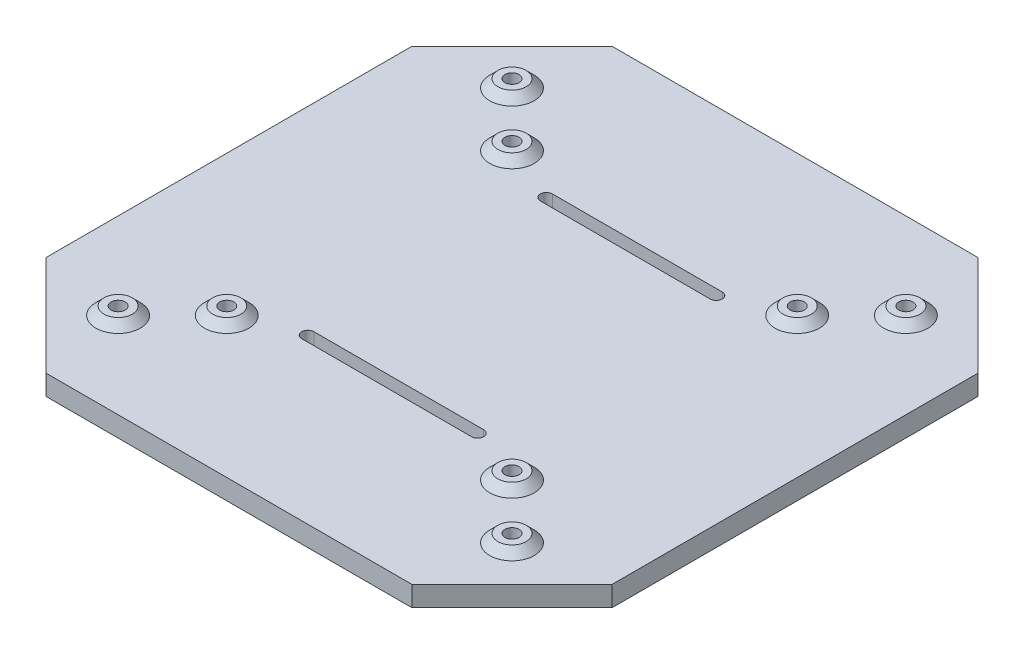
ISO-10303-21;
HEADER;
FILE_DESCRIPTION(('STEP AP214'),'2;1');
FILE_NAME('part.step','',(''),(''),'','','');
FILE_SCHEMA(('AUTOMOTIVE_DESIGN { 1 0 10303 214 1 1 1 1 }'));
ENDSEC;
DATA;
#1=APPLICATION_CONTEXT('core data for automotive mechanical design processes');
#2=APPLICATION_PROTOCOL_DEFINITION('international standard','automotive_design',2000,#1);
#3=PRODUCT_CONTEXT('',#1,'mechanical');
#4=PRODUCT('Part','Part','',(#3));
#5=PRODUCT_RELATED_PRODUCT_CATEGORY('part','',(#4));
#6=PRODUCT_DEFINITION_FORMATION('','',#4);
#7=PRODUCT_DEFINITION_CONTEXT('part definition',#1,'design');
#8=PRODUCT_DEFINITION('design','',#6,#7);
#9=PRODUCT_DEFINITION_SHAPE('','',#8);
#10=(LENGTH_UNIT() NAMED_UNIT(*) SI_UNIT(.MILLI.,.METRE.));
#11=(NAMED_UNIT(*) PLANE_ANGLE_UNIT() SI_UNIT($,.RADIAN.));
#12=(NAMED_UNIT(*) SI_UNIT($,.STERADIAN.) SOLID_ANGLE_UNIT());
#13=UNCERTAINTY_MEASURE_WITH_UNIT(LENGTH_MEASURE(1.E-05),#10,'distance_accuracy_value','');
#14=(GEOMETRIC_REPRESENTATION_CONTEXT(3) GLOBAL_UNCERTAINTY_ASSIGNED_CONTEXT((#13)) GLOBAL_UNIT_ASSIGNED_CONTEXT((#10,
#11,#12)) REPRESENTATION_CONTEXT('',''));
#15=CARTESIAN_POINT('',(0.,0.,0.));
#16=DIRECTION('',(0.,0.,1.));
#17=DIRECTION('',(1.,0.,0.));
#18=AXIS2_PLACEMENT_3D('',#15,#16,#17);
#19=CARTESIAN_POINT('',(0.,5.,0.));
#20=DIRECTION('',(0.,1.,0.));
#21=DIRECTION('',(0.,0.,1.));
#22=AXIS2_PLACEMENT_3D('',#19,#20,#21);
#23=PLANE('',#22);
#24=CARTESIAN_POINT('',(92.8000157602954,5.,88.1009215271201));
#25=DIRECTION('',(0.,1.,0.));
#26=DIRECTION('',(0.,0.,1.));
#27=AXIS2_PLACEMENT_3D('',#24,#25,#26);
#28=CIRCLE('',#27,5.50000000000002);
#29=CARTESIAN_POINT('',(92.8000157602954,5.,93.6009215271201));
#30=VERTEX_POINT('',#29);
#31=EDGE_CURVE('E371',#30,#30,#28,.T.);
#32=ORIENTED_EDGE('',*,*,#31,.F.);
#33=EDGE_LOOP('',(#32));
#34=FACE_BOUND('',#33,.T.);
#35=CARTESIAN_POINT('',(92.8000157602944,5.,-9.31614910521544));
#36=DIRECTION('',(0.,1.,0.));
#37=DIRECTION('',(0.,0.,1.));
#38=AXIS2_PLACEMENT_3D('',#35,#36,#37);
#39=CIRCLE('',#38,5.5);
#40=CARTESIAN_POINT('',(92.8000157602944,5.,-3.81614910521545));
#41=VERTEX_POINT('',#40);
#42=EDGE_CURVE('E495',#41,#41,#39,.T.);
#43=ORIENTED_EDGE('',*,*,#42,.F.);
#44=EDGE_LOOP('',(#43));
#45=FACE_BOUND('',#44,.T.);
#46=CARTESIAN_POINT('',(-4.61705487204114,5.,-9.31614910521412));
#47=DIRECTION('',(0.,1.,0.));
#48=DIRECTION('',(0.,0.,1.));
#49=AXIS2_PLACEMENT_3D('',#46,#47,#48);
#50=CIRCLE('',#49,5.50000000000001);
#51=CARTESIAN_POINT('',(-4.61705487204114,5.,-3.81614910521412));
#52=VERTEX_POINT('',#51);
#53=EDGE_CURVE('E499',#52,#52,#50,.T.);
#54=ORIENTED_EDGE('',*,*,#53,.F.);
#55=EDGE_LOOP('',(#54));
#56=FACE_BOUND('',#55,.T.);
#57=CARTESIAN_POINT('',(-4.61705487203946,5.,88.1009215271214));
#58=DIRECTION('',(0.,1.,0.));
#59=DIRECTION('',(0.,0.,1.));
#60=AXIS2_PLACEMENT_3D('',#57,#58,#59);
#61=CIRCLE('',#60,5.5);
#62=CARTESIAN_POINT('',(-4.61705487203946,5.,93.6009215271214));
#63=VERTEX_POINT('',#62);
#64=EDGE_CURVE('E172',#63,#63,#61,.T.);
#65=ORIENTED_EDGE('',*,*,#64,.F.);
#66=EDGE_LOOP('',(#65));
#67=FACE_BOUND('',#66,.T.);
#68=CARTESIAN_POINT('',(23.0914804441269,5.,9.89238621095243));
#69=DIRECTION('',(0.,1.,0.));
#70=DIRECTION('',(0.,0.,1.));
#71=AXIS2_PLACEMENT_3D('',#68,#69,#70);
#72=CIRCLE('',#71,1.5);
#73=CARTESIAN_POINT('',(23.0914804441269,5.,8.39238621095243));
#74=VERTEX_POINT('',#73);
#75=CARTESIAN_POINT('',(23.0914804441269,5.,11.3923862109524));
#76=VERTEX_POINT('',#75);
#77=EDGE_CURVE('E50',#74,#76,#72,.T.);
#78=ORIENTED_EDGE('',*,*,#77,.F.);
#79=DIRECTION('',(-1.,0.,0.));
#80=VECTOR('',#79,1.);
#81=CARTESIAN_POINT('',(65.0914804441269,5.,8.39238621095241));
#82=LINE('',#81,#80);
#83=CARTESIAN_POINT('',(65.0914804441269,5.,8.39238621095241));
#84=VERTEX_POINT('',#83);
#85=EDGE_CURVE('E166',#84,#74,#82,.T.);
#86=ORIENTED_EDGE('',*,*,#85,.F.);
#87=CARTESIAN_POINT('',(65.0914804441269,5.,9.89238621095243));
#88=DIRECTION('',(0.,1.,0.));
#89=DIRECTION('',(0.,0.,-1.));
#90=AXIS2_PLACEMENT_3D('',#87,#88,#89);
#91=CIRCLE('',#90,1.50000000000001);
#92=CARTESIAN_POINT('',(65.0914804441269,5.,11.3923862109524));
#93=VERTEX_POINT('',#92);
#94=EDGE_CURVE('E169',#93,#84,#91,.T.);
#95=ORIENTED_EDGE('',*,*,#94,.F.);
#96=DIRECTION('',(1.,0.,0.));
#97=VECTOR('',#96,1.);
#98=CARTESIAN_POINT('',(23.0914804441269,5.,11.3923862109524));
#99=LINE('',#98,#97);
#100=EDGE_CURVE('E178',#76,#93,#99,.T.);
#101=ORIENTED_EDGE('',*,*,#100,.F.);
#102=EDGE_LOOP('',(#78,#86,#95,#101));
#103=FACE_BOUND('',#102,.T.);
#104=CARTESIAN_POINT('',(65.0914804441269,5.,68.8923862109524));
#105=DIRECTION('',(0.,1.,0.));
#106=DIRECTION('',(0.,0.,-1.));
#107=AXIS2_PLACEMENT_3D('',#104,#105,#106);
#108=CIRCLE('',#107,1.50377722057659);
#109=CARTESIAN_POINT('',(64.9849631726398,5.,70.3923862109524));
#110=VERTEX_POINT('',#109);
#111=CARTESIAN_POINT('',(64.9849631726398,5.,67.3923862109524));
#112=VERTEX_POINT('',#111);
#113=EDGE_CURVE('E184',#110,#112,#108,.T.);
#114=ORIENTED_EDGE('',*,*,#113,.F.);
#115=DIRECTION('',(1.,0.,0.));
#116=VECTOR('',#115,1.);
#117=CARTESIAN_POINT('',(23.0914804441269,5.,70.3923862109524));
#118=LINE('',#117,#116);
#119=CARTESIAN_POINT('',(23.0914804441269,5.,70.3923862109524));
#120=VERTEX_POINT('',#119);
#121=EDGE_CURVE('E192',#120,#110,#118,.T.);
#122=ORIENTED_EDGE('',*,*,#121,.F.);
#123=CARTESIAN_POINT('',(23.0914804441269,5.,68.8923862109524));
#124=DIRECTION('',(0.,1.,0.));
#125=DIRECTION('',(0.,0.,1.));
#126=AXIS2_PLACEMENT_3D('',#123,#124,#125);
#127=CIRCLE('',#126,1.49999999999999);
#128=CARTESIAN_POINT('',(23.0914804441269,5.,67.3923862109524));
#129=VERTEX_POINT('',#128);
#130=EDGE_CURVE('E206',#129,#120,#127,.T.);
#131=ORIENTED_EDGE('',*,*,#130,.F.);
#132=DIRECTION('',(-1.,0.,0.));
#133=VECTOR('',#132,1.);
#134=CARTESIAN_POINT('',(64.9849631726398,5.,67.3923862109524));
#135=LINE('',#134,#133);
#136=EDGE_CURVE('E203',#112,#129,#135,.T.);
#137=ORIENTED_EDGE('',*,*,#136,.F.);
#138=EDGE_LOOP('',(#114,#122,#131,#137));
#139=FACE_BOUND('',#138,.T.);
#140=DIRECTION('',(-0.707106781186539,0.,-0.707106781186556));
#141=VECTOR('',#140,1.);
#142=CARTESIAN_POINT('',(-25.9085195558723,5.,84.6436488694239));
#143=LINE('',#142,#141);
#144=CARTESIAN_POINT('',(-1.15978221434344,5.,109.392386210953));
#145=VERTEX_POINT('',#144);
#146=CARTESIAN_POINT('',(-25.9085195558723,5.,84.6436488694239));
#147=VERTEX_POINT('',#146);
#148=EDGE_CURVE('E213',#145,#147,#143,.T.);
#149=ORIENTED_EDGE('',*,*,#148,.F.);
#150=DIRECTION('',(1.,0.,0.));
#151=VECTOR('',#150,1.);
#152=CARTESIAN_POINT('',(-25.9085195558734,5.,109.392386210953));
#153=LINE('',#152,#151);
#154=CARTESIAN_POINT('',(89.3427431025989,5.,109.392386210953));
#155=VERTEX_POINT('',#154);
#156=EDGE_CURVE('E266',#145,#155,#153,.T.);
#157=ORIENTED_EDGE('',*,*,#156,.T.);
#158=DIRECTION('',(-0.707106781186554,0.,0.707106781186541));
#159=VECTOR('',#158,1.);
#160=CARTESIAN_POINT('',(89.3427431025989,5.,109.392386210953));
#161=LINE('',#160,#159);
#162=CARTESIAN_POINT('',(114.091480444128,5.,84.6436488694236));
#163=VERTEX_POINT('',#162);
#164=EDGE_CURVE('E228',#163,#155,#161,.T.);
#165=ORIENTED_EDGE('',*,*,#164,.F.);
#166=DIRECTION('',(0.,0.,-1.));
#167=VECTOR('',#166,1.);
#168=CARTESIAN_POINT('',(114.091480444127,5.,-30.6076137890466));
#169=LINE('',#168,#167);
#170=CARTESIAN_POINT('',(114.091480444127,5.,-5.85887644751872));
#171=VERTEX_POINT('',#170);
#172=EDGE_CURVE('E269',#163,#171,#169,.T.);
#173=ORIENTED_EDGE('',*,*,#172,.T.);
#174=DIRECTION('',(0.707106781186543,0.,0.707106781186551));
#175=VECTOR('',#174,1.);
#176=CARTESIAN_POINT('',(114.091480444127,5.,-5.85887644751872));
#177=LINE('',#176,#175);
#178=CARTESIAN_POINT('',(89.3427431025981,5.,-30.607613789048));
#179=VERTEX_POINT('',#178);
#180=EDGE_CURVE('E239',#179,#171,#177,.T.);
#181=ORIENTED_EDGE('',*,*,#180,.F.);
#182=DIRECTION('',(-1.,0.,0.));
#183=VECTOR('',#182,1.);
#184=CARTESIAN_POINT('',(-25.9085195558735,5.,-30.6076137890466));
#185=LINE('',#184,#183);
#186=CARTESIAN_POINT('',(-1.15978221434423,5.,-30.6076137890466));
#187=VERTEX_POINT('',#186);
#188=EDGE_CURVE('E271',#179,#187,#185,.T.);
#189=ORIENTED_EDGE('',*,*,#188,.T.);
#190=DIRECTION('',(0.707106781186549,0.,-0.707106781186546));
#191=VECTOR('',#190,1.);
#192=CARTESIAN_POINT('',(-1.15978221434423,5.,-30.6076137890466));
#193=LINE('',#192,#191);
#194=CARTESIAN_POINT('',(-25.9085195558734,5.,-5.85887644751746));
#195=VERTEX_POINT('',#194);
#196=EDGE_CURVE('E250',#195,#187,#193,.T.);
#197=ORIENTED_EDGE('',*,*,#196,.F.);
#198=DIRECTION('',(0.,0.,1.));
#199=VECTOR('',#198,1.);
#200=CARTESIAN_POINT('',(-25.9085195558735,5.,-30.6076137890466));
#201=LINE('',#200,#199);
#202=EDGE_CURVE('E263',#195,#147,#201,.T.);
#203=ORIENTED_EDGE('',*,*,#202,.T.);
#204=EDGE_LOOP('',(#149,#157,#165,#173,#181,#189,#197,#203));
#205=FACE_BOUND('',#204,.T.);
#206=CARTESIAN_POINT('',(8.8179739705049,5.,74.665892684577));
#207=DIRECTION('',(0.,1.,0.));
#208=DIRECTION('',(0.,0.,1.));
#209=AXIS2_PLACEMENT_3D('',#206,#207,#208);
#210=CIRCLE('',#209,5.5);
#211=CARTESIAN_POINT('',(8.8179739705049,5.,80.165892684577));
#212=VERTEX_POINT('',#211);
#213=EDGE_CURVE('E474',#212,#212,#210,.T.);
#214=ORIENTED_EDGE('',*,*,#213,.F.);
#215=EDGE_LOOP('',(#214));
#216=FACE_BOUND('',#215,.T.);
#217=CARTESIAN_POINT('',(8.81797397050321,5.,4.11887973733029));
#218=DIRECTION('',(0.,1.,0.));
#219=DIRECTION('',(0.,0.,1.));
#220=AXIS2_PLACEMENT_3D('',#217,#218,#219);
#221=CIRCLE('',#220,5.5);
#222=CARTESIAN_POINT('',(8.81797397050321,5.,9.61887973733029));
#223=VERTEX_POINT('',#222);
#224=EDGE_CURVE('E478',#223,#223,#221,.T.);
#225=ORIENTED_EDGE('',*,*,#224,.F.);
#226=EDGE_LOOP('',(#225));
#227=FACE_BOUND('',#226,.T.);
#228=CARTESIAN_POINT('',(79.36498691775,5.,4.11887973732887));
#229=DIRECTION('',(0.,1.,0.));
#230=DIRECTION('',(0.,0.,1.));
#231=AXIS2_PLACEMENT_3D('',#228,#229,#230);
#232=CIRCLE('',#231,5.49999999999999);
#233=CARTESIAN_POINT('',(79.36498691775,5.,9.61887973732886));
#234=VERTEX_POINT('',#233);
#235=EDGE_CURVE('E482',#234,#234,#232,.T.);
#236=ORIENTED_EDGE('',*,*,#235,.F.);
#237=EDGE_LOOP('',(#236));
#238=FACE_BOUND('',#237,.T.);
#239=CARTESIAN_POINT('',(79.3649869177512,5.,74.6658926845756));
#240=DIRECTION('',(0.,1.,0.));
#241=DIRECTION('',(0.,0.,1.));
#242=AXIS2_PLACEMENT_3D('',#239,#240,#241);
#243=CIRCLE('',#242,5.5);
#244=CARTESIAN_POINT('',(79.3649869177512,5.,80.1658926845756));
#245=VERTEX_POINT('',#244);
#246=EDGE_CURVE('E485',#245,#245,#243,.T.);
#247=ORIENTED_EDGE('',*,*,#246,.F.);
#248=EDGE_LOOP('',(#247));
#249=FACE_BOUND('',#248,.T.);
#250=ADVANCED_FACE('F35',(#34,#45,#56,#67,#103,#139,#205,#216,#227,#238,#249),#23,.T.);
#251=CARTESIAN_POINT('',(-25.9085195558735,5.,-30.6076137890466));
#252=DIRECTION('',(1.,0.,0.));
#253=DIRECTION('',(0.,0.,-1.));
#254=AXIS2_PLACEMENT_3D('',#251,#252,#253);
#255=PLANE('',#254);
#256=DIRECTION('',(0.,0.,1.));
#257=VECTOR('',#256,1.);
#258=CARTESIAN_POINT('',(-25.9085195558735,0.,-30.6076137890466));
#259=LINE('',#258,#257);
#260=CARTESIAN_POINT('',(-25.9085195558734,0.,-5.85887644751746));
#261=VERTEX_POINT('',#260);
#262=CARTESIAN_POINT('',(-25.9085195558734,0.,84.6436488694227));
#263=VERTEX_POINT('',#262);
#264=EDGE_CURVE('E261',#261,#263,#259,.T.);
#265=ORIENTED_EDGE('',*,*,#264,.T.);
#266=DIRECTION('',(0.,1.,0.));
#267=VECTOR('',#266,1.);
#268=CARTESIAN_POINT('',(-25.9085195558723,0.,84.6436488694239));
#269=LINE('',#268,#267);
#270=EDGE_CURVE('E225',#263,#147,#269,.T.);
#271=ORIENTED_EDGE('',*,*,#270,.T.);
#272=ORIENTED_EDGE('',*,*,#202,.F.);
#273=DIRECTION('',(0.,1.,0.));
#274=VECTOR('',#273,1.);
#275=CARTESIAN_POINT('',(-25.9085195558734,0.,-5.85887644751746));
#276=LINE('',#275,#274);
#277=EDGE_CURVE('E255',#261,#195,#276,.T.);
#278=ORIENTED_EDGE('',*,*,#277,.F.);
#279=EDGE_LOOP('',(#265,#271,#272,#278));
#280=FACE_BOUND('',#279,.T.);
#281=ADVANCED_FACE('F317',(#280),#255,.F.);
#282=CARTESIAN_POINT('',(-25.9085195558734,5.,109.392386210953));
#283=DIRECTION('',(0.,0.,-1.));
#284=DIRECTION('',(-1.,0.,0.));
#285=AXIS2_PLACEMENT_3D('',#282,#283,#284);
#286=PLANE('',#285);
#287=ORIENTED_EDGE('',*,*,#156,.F.);
#288=DIRECTION('',(0.,1.,0.));
#289=VECTOR('',#288,1.);
#290=CARTESIAN_POINT('',(-1.15978221434344,0.,109.392386210953));
#291=LINE('',#290,#289);
#292=CARTESIAN_POINT('',(-1.15978221434344,0.,109.392386210953));
#293=VERTEX_POINT('',#292);
#294=EDGE_CURVE('E223',#293,#145,#291,.T.);
#295=ORIENTED_EDGE('',*,*,#294,.F.);
#296=DIRECTION('',(1.,0.,0.));
#297=VECTOR('',#296,1.);
#298=CARTESIAN_POINT('',(-25.9085195558734,0.,109.392386210953));
#299=LINE('',#298,#297);
#300=CARTESIAN_POINT('',(89.3427431025979,0.,109.392386210953));
#301=VERTEX_POINT('',#300);
#302=EDGE_CURVE('E276',#293,#301,#299,.T.);
#303=ORIENTED_EDGE('',*,*,#302,.T.);
#304=DIRECTION('',(0.,1.,0.));
#305=VECTOR('',#304,1.);
#306=CARTESIAN_POINT('',(89.3427431025989,0.,109.392386210953));
#307=LINE('',#306,#305);
#308=EDGE_CURVE('E236',#301,#155,#307,.T.);
#309=ORIENTED_EDGE('',*,*,#308,.T.);
#310=EDGE_LOOP('',(#287,#295,#303,#309));
#311=FACE_BOUND('',#310,.T.);
#312=ADVANCED_FACE('F325',(#311),#286,.F.);
#313=CARTESIAN_POINT('',(114.091480444127,5.,-30.6076137890466));
#314=DIRECTION('',(-1.,0.,0.));
#315=DIRECTION('',(0.,0.,1.));
#316=AXIS2_PLACEMENT_3D('',#313,#314,#315);
#317=PLANE('',#316);
#318=ORIENTED_EDGE('',*,*,#172,.F.);
#319=DIRECTION('',(0.,1.,0.));
#320=VECTOR('',#319,1.);
#321=CARTESIAN_POINT('',(114.091480444128,0.,84.6436488694236));
#322=LINE('',#321,#320);
#323=CARTESIAN_POINT('',(114.091480444128,0.,84.6436488694236));
#324=VERTEX_POINT('',#323);
#325=EDGE_CURVE('E233',#324,#163,#322,.T.);
#326=ORIENTED_EDGE('',*,*,#325,.F.);
#327=DIRECTION('',(0.,0.,-1.));
#328=VECTOR('',#327,1.);
#329=CARTESIAN_POINT('',(114.091480444127,0.,-30.6076137890466));
#330=LINE('',#329,#328);
#331=CARTESIAN_POINT('',(114.091480444127,0.,-5.85887644751923));
#332=VERTEX_POINT('',#331);
#333=EDGE_CURVE('E278',#324,#332,#330,.T.);
#334=ORIENTED_EDGE('',*,*,#333,.T.);
#335=DIRECTION('',(0.,1.,0.));
#336=VECTOR('',#335,1.);
#337=CARTESIAN_POINT('',(114.091480444127,0.,-5.85887644751872));
#338=LINE('',#337,#336);
#339=EDGE_CURVE('E247',#332,#171,#338,.T.);
#340=ORIENTED_EDGE('',*,*,#339,.T.);
#341=EDGE_LOOP('',(#318,#326,#334,#340));
#342=FACE_BOUND('',#341,.T.);
#343=ADVANCED_FACE('F340',(#342),#317,.F.);
#344=CARTESIAN_POINT('',(-25.9085195558735,5.,-30.6076137890466));
#345=DIRECTION('',(0.,0.,1.));
#346=DIRECTION('',(1.,0.,0.));
#347=AXIS2_PLACEMENT_3D('',#344,#345,#346);
#348=PLANE('',#347);
#349=ORIENTED_EDGE('',*,*,#188,.F.);
#350=DIRECTION('',(0.,1.,0.));
#351=VECTOR('',#350,1.);
#352=CARTESIAN_POINT('',(89.3427431025981,0.,-30.607613789048));
#353=LINE('',#352,#351);
#354=CARTESIAN_POINT('',(89.3427431025981,0.,-30.607613789048));
#355=VERTEX_POINT('',#354);
#356=EDGE_CURVE('E244',#355,#179,#353,.T.);
#357=ORIENTED_EDGE('',*,*,#356,.F.);
#358=DIRECTION('',(-1.,0.,0.));
#359=VECTOR('',#358,1.);
#360=CARTESIAN_POINT('',(-25.9085195558735,0.,-30.6076137890466));
#361=LINE('',#360,#359);
#362=CARTESIAN_POINT('',(-1.15978221434423,0.,-30.6076137890466));
#363=VERTEX_POINT('',#362);
#364=EDGE_CURVE('E267',#355,#363,#361,.T.);
#365=ORIENTED_EDGE('',*,*,#364,.T.);
#366=DIRECTION('',(0.,1.,0.));
#367=VECTOR('',#366,1.);
#368=CARTESIAN_POINT('',(-1.15978221434423,0.,-30.6076137890466));
#369=LINE('',#368,#367);
#370=EDGE_CURVE('E258',#363,#187,#369,.T.);
#371=ORIENTED_EDGE('',*,*,#370,.T.);
#372=EDGE_LOOP('',(#349,#357,#365,#371));
#373=FACE_BOUND('',#372,.T.);
#374=ADVANCED_FACE('F336',(#373),#348,.F.);
#375=CARTESIAN_POINT('',(0.,0.,0.));
#376=DIRECTION('',(0.,1.,0.));
#377=DIRECTION('',(0.,0.,1.));
#378=AXIS2_PLACEMENT_3D('',#375,#376,#377);
#379=PLANE('',#378);
#380=CARTESIAN_POINT('',(79.3649869177514,0.,74.6658926845787));
#381=DIRECTION('',(0.,1.,0.));
#382=DIRECTION('',(0.,0.,1.));
#383=AXIS2_PLACEMENT_3D('',#380,#381,#382);
#384=CIRCLE('',#383,1.75000000000001);
#385=CARTESIAN_POINT('',(79.3649869177514,0.,76.4158926845787));
#386=VERTEX_POINT('',#385);
#387=EDGE_CURVE('E570',#386,#386,#384,.T.);
#388=ORIENTED_EDGE('',*,*,#387,.T.);
#389=EDGE_LOOP('',(#388));
#390=FACE_BOUND('',#389,.T.);
#391=CARTESIAN_POINT('',(92.8000157602962,0.,88.1009215271227));
#392=DIRECTION('',(0.,1.,0.));
#393=DIRECTION('',(0.,0.,1.));
#394=AXIS2_PLACEMENT_3D('',#391,#392,#393);
#395=CIRCLE('',#394,1.74999999999998);
#396=CARTESIAN_POINT('',(92.8000157602962,0.,89.8509215271226));
#397=VERTEX_POINT('',#396);
#398=EDGE_CURVE('E564',#397,#397,#395,.T.);
#399=ORIENTED_EDGE('',*,*,#398,.T.);
#400=EDGE_LOOP('',(#399));
#401=FACE_BOUND('',#400,.T.);
#402=CARTESIAN_POINT('',(79.3649869177533,0.,4.11887973733166));
#403=DIRECTION('',(0.,1.,0.));
#404=DIRECTION('',(0.,0.,1.));
#405=AXIS2_PLACEMENT_3D('',#402,#403,#404);
#406=CIRCLE('',#405,1.74999999999999);
#407=CARTESIAN_POINT('',(79.3649869177533,0.,5.86887973733165));
#408=VERTEX_POINT('',#407);
#409=EDGE_CURVE('E558',#408,#408,#406,.T.);
#410=ORIENTED_EDGE('',*,*,#409,.T.);
#411=EDGE_LOOP('',(#410));
#412=FACE_BOUND('',#411,.T.);
#413=CARTESIAN_POINT('',(92.8000157602974,0.,-9.316149105213));
#414=DIRECTION('',(0.,1.,0.));
#415=DIRECTION('',(0.,0.,1.));
#416=AXIS2_PLACEMENT_3D('',#413,#414,#415);
#417=CIRCLE('',#416,1.75);
#418=CARTESIAN_POINT('',(92.8000157602974,0.,-7.566149105213));
#419=VERTEX_POINT('',#418);
#420=EDGE_CURVE('E552',#419,#419,#417,.T.);
#421=ORIENTED_EDGE('',*,*,#420,.T.);
#422=EDGE_LOOP('',(#421));
#423=FACE_BOUND('',#422,.T.);
#424=CARTESIAN_POINT('',(8.81797397050627,0.,4.11887973733004));
#425=DIRECTION('',(0.,1.,0.));
#426=DIRECTION('',(0.,0.,1.));
#427=AXIS2_PLACEMENT_3D('',#424,#425,#426);
#428=CIRCLE('',#427,1.75);
#429=CARTESIAN_POINT('',(8.81797397050627,0.,5.86887973733004));
#430=VERTEX_POINT('',#429);
#431=EDGE_CURVE('E546',#430,#430,#428,.T.);
#432=ORIENTED_EDGE('',*,*,#431,.T.);
#433=EDGE_LOOP('',(#432));
#434=FACE_BOUND('',#433,.T.);
#435=CARTESIAN_POINT('',(-4.61705487203827,0.,-9.3161491052142));
#436=DIRECTION('',(0.,1.,0.));
#437=DIRECTION('',(0.,0.,1.));
#438=AXIS2_PLACEMENT_3D('',#435,#436,#437);
#439=CIRCLE('',#438,1.75);
#440=CARTESIAN_POINT('',(-4.61705487203827,0.,-7.5661491052142));
#441=VERTEX_POINT('',#440);
#442=EDGE_CURVE('E540',#441,#441,#439,.T.);
#443=ORIENTED_EDGE('',*,*,#442,.T.);
#444=EDGE_LOOP('',(#443));
#445=FACE_BOUND('',#444,.T.);
#446=CARTESIAN_POINT('',(8.8179739705049,0.,74.665892684577));
#447=DIRECTION('',(0.,1.,0.));
#448=DIRECTION('',(0.,0.,1.));
#449=AXIS2_PLACEMENT_3D('',#446,#447,#448);
#450=CIRCLE('',#449,1.75);
#451=CARTESIAN_POINT('',(8.8179739705049,0.,76.415892684577));
#452=VERTEX_POINT('',#451);
#453=EDGE_CURVE('E535',#452,#452,#450,.T.);
#454=ORIENTED_EDGE('',*,*,#453,.T.);
#455=EDGE_LOOP('',(#454));
#456=FACE_BOUND('',#455,.T.);
#457=CARTESIAN_POINT('',(-4.61705487203946,0.,88.1009215271214));
#458=DIRECTION('',(0.,1.,0.));
#459=DIRECTION('',(0.,0.,1.));
#460=AXIS2_PLACEMENT_3D('',#457,#458,#459);
#461=CIRCLE('',#460,1.75);
#462=CARTESIAN_POINT('',(-4.61705487203946,0.,89.8509215271214));
#463=VERTEX_POINT('',#462);
#464=EDGE_CURVE('E486',#463,#463,#461,.T.);
#465=ORIENTED_EDGE('',*,*,#464,.T.);
#466=EDGE_LOOP('',(#465));
#467=FACE_BOUND('',#466,.T.);
#468=DIRECTION('',(-1.,0.,0.));
#469=VECTOR('',#468,1.);
#470=CARTESIAN_POINT('',(65.0914804441269,0.,8.39238621095241));
#471=LINE('',#470,#469);
#472=CARTESIAN_POINT('',(65.0914804441269,0.,8.39238621095241));
#473=VERTEX_POINT('',#472);
#474=CARTESIAN_POINT('',(23.0914804441269,0.,8.39238621095243));
#475=VERTEX_POINT('',#474);
#476=EDGE_CURVE('E156',#473,#475,#471,.T.);
#477=ORIENTED_EDGE('',*,*,#476,.T.);
#478=CARTESIAN_POINT('',(23.0914804441269,0.,9.89238621095243));
#479=DIRECTION('',(0.,1.,0.));
#480=DIRECTION('',(0.,0.,1.));
#481=AXIS2_PLACEMENT_3D('',#478,#479,#480);
#482=CIRCLE('',#481,1.5);
#483=CARTESIAN_POINT('',(23.0914804441269,0.,11.3923862109524));
#484=VERTEX_POINT('',#483);
#485=EDGE_CURVE('E150',#475,#484,#482,.T.);
#486=ORIENTED_EDGE('',*,*,#485,.T.);
#487=DIRECTION('',(1.,0.,0.));
#488=VECTOR('',#487,1.);
#489=CARTESIAN_POINT('',(23.0914804441269,0.,11.3923862109524));
#490=LINE('',#489,#488);
#491=CARTESIAN_POINT('',(65.0914804441269,0.,11.3923862109524));
#492=VERTEX_POINT('',#491);
#493=EDGE_CURVE('E159',#484,#492,#490,.T.);
#494=ORIENTED_EDGE('',*,*,#493,.T.);
#495=CARTESIAN_POINT('',(65.0914804441269,0.,9.89238621095243));
#496=DIRECTION('',(0.,1.,0.));
#497=DIRECTION('',(0.,0.,-1.));
#498=AXIS2_PLACEMENT_3D('',#495,#496,#497);
#499=CIRCLE('',#498,1.50000000000001);
#500=EDGE_CURVE('E58',#492,#473,#499,.T.);
#501=ORIENTED_EDGE('',*,*,#500,.T.);
#502=EDGE_LOOP('',(#477,#486,#494,#501));
#503=FACE_BOUND('',#502,.T.);
#504=DIRECTION('',(1.,0.,0.));
#505=VECTOR('',#504,1.);
#506=CARTESIAN_POINT('',(23.0914804441269,0.,70.3923862109524));
#507=LINE('',#506,#505);
#508=CARTESIAN_POINT('',(23.0914804441269,0.,70.3923862109524));
#509=VERTEX_POINT('',#508);
#510=CARTESIAN_POINT('',(64.9849631726398,0.,70.3923862109524));
#511=VERTEX_POINT('',#510);
#512=EDGE_CURVE('E198',#509,#511,#507,.T.);
#513=ORIENTED_EDGE('',*,*,#512,.T.);
#514=CARTESIAN_POINT('',(65.0914804441269,0.,68.8923862109524));
#515=DIRECTION('',(0.,1.,0.));
#516=DIRECTION('',(0.,0.,-1.));
#517=AXIS2_PLACEMENT_3D('',#514,#515,#516);
#518=CIRCLE('',#517,1.50377722057659);
#519=CARTESIAN_POINT('',(64.9849631726398,0.,67.3923862109524));
#520=VERTEX_POINT('',#519);
#521=EDGE_CURVE('E188',#511,#520,#518,.T.);
#522=ORIENTED_EDGE('',*,*,#521,.T.);
#523=DIRECTION('',(-1.,0.,0.));
#524=VECTOR('',#523,1.);
#525=CARTESIAN_POINT('',(64.9849631726398,0.,67.3923862109524));
#526=LINE('',#525,#524);
#527=CARTESIAN_POINT('',(23.0914804441269,0.,67.3923862109524));
#528=VERTEX_POINT('',#527);
#529=EDGE_CURVE('E191',#520,#528,#526,.T.);
#530=ORIENTED_EDGE('',*,*,#529,.T.);
#531=CARTESIAN_POINT('',(23.0914804441269,0.,68.8923862109524));
#532=DIRECTION('',(0.,1.,0.));
#533=DIRECTION('',(0.,0.,1.));
#534=AXIS2_PLACEMENT_3D('',#531,#532,#533);
#535=CIRCLE('',#534,1.49999999999999);
#536=EDGE_CURVE('E195',#528,#509,#535,.T.);
#537=ORIENTED_EDGE('',*,*,#536,.T.);
#538=EDGE_LOOP('',(#513,#522,#530,#537));
#539=FACE_BOUND('',#538,.T.);
#540=ORIENTED_EDGE('',*,*,#302,.F.);
#541=DIRECTION('',(-0.707106781186539,0.,-0.707106781186556));
#542=VECTOR('',#541,1.);
#543=CARTESIAN_POINT('',(-25.9085195558723,0.,84.6436488694239));
#544=LINE('',#543,#542);
#545=EDGE_CURVE('E220',#293,#263,#544,.T.);
#546=ORIENTED_EDGE('',*,*,#545,.T.);
#547=ORIENTED_EDGE('',*,*,#264,.F.);
#548=DIRECTION('',(0.707106781186549,0.,-0.707106781186546));
#549=VECTOR('',#548,1.);
#550=CARTESIAN_POINT('',(-1.15978221434423,0.,-30.6076137890466));
#551=LINE('',#550,#549);
#552=EDGE_CURVE('E252',#261,#363,#551,.T.);
#553=ORIENTED_EDGE('',*,*,#552,.T.);
#554=ORIENTED_EDGE('',*,*,#364,.F.);
#555=DIRECTION('',(0.707106781186543,0.,0.707106781186551));
#556=VECTOR('',#555,1.);
#557=CARTESIAN_POINT('',(114.091480444127,0.,-5.85887644751872));
#558=LINE('',#557,#556);
#559=EDGE_CURVE('E241',#355,#332,#558,.T.);
#560=ORIENTED_EDGE('',*,*,#559,.T.);
#561=ORIENTED_EDGE('',*,*,#333,.F.);
#562=DIRECTION('',(-0.707106781186554,0.,0.707106781186541));
#563=VECTOR('',#562,1.);
#564=CARTESIAN_POINT('',(89.3427431025989,0.,109.392386210953));
#565=LINE('',#564,#563);
#566=EDGE_CURVE('E230',#324,#301,#565,.T.);
#567=ORIENTED_EDGE('',*,*,#566,.T.);
#568=EDGE_LOOP('',(#540,#546,#547,#553,#554,#560,#561,#567));
#569=FACE_BOUND('',#568,.T.);
#570=ADVANCED_FACE('F163',(#390,#401,#412,#423,#434,#445,#456,#467,#503,#539,#569),#379,.F.);
#571=CARTESIAN_POINT('',(-1.15978221434423,0.,-30.6076137890466));
#572=DIRECTION('',(0.707106781186546,0.,0.707106781186549));
#573=DIRECTION('',(0.707106781186549,0.,-0.707106781186546));
#574=AXIS2_PLACEMENT_3D('',#571,#572,#573);
#575=PLANE('',#574);
#576=ORIENTED_EDGE('',*,*,#196,.T.);
#577=ORIENTED_EDGE('',*,*,#370,.F.);
#578=ORIENTED_EDGE('',*,*,#552,.F.);
#579=ORIENTED_EDGE('',*,*,#277,.T.);
#580=EDGE_LOOP('',(#576,#577,#578,#579));
#581=FACE_BOUND('',#580,.T.);
#582=ADVANCED_FACE('F332',(#581),#575,.F.);
#583=CARTESIAN_POINT('',(114.091480444127,0.,-5.85887644751872));
#584=DIRECTION('',(-0.707106781186551,0.,0.707106781186544));
#585=DIRECTION('',(0.707106781186544,0.,0.707106781186551));
#586=AXIS2_PLACEMENT_3D('',#583,#584,#585);
#587=PLANE('',#586);
#588=ORIENTED_EDGE('',*,*,#180,.T.);
#589=ORIENTED_EDGE('',*,*,#339,.F.);
#590=ORIENTED_EDGE('',*,*,#559,.F.);
#591=ORIENTED_EDGE('',*,*,#356,.T.);
#592=EDGE_LOOP('',(#588,#589,#590,#591));
#593=FACE_BOUND('',#592,.T.);
#594=ADVANCED_FACE('F442',(#593),#587,.F.);
#595=CARTESIAN_POINT('',(89.3427431025989,0.,109.392386210953));
#596=DIRECTION('',(-0.707106781186541,0.,-0.707106781186554));
#597=DIRECTION('',(-0.707106781186554,0.,0.707106781186541));
#598=AXIS2_PLACEMENT_3D('',#595,#596,#597);
#599=PLANE('',#598);
#600=ORIENTED_EDGE('',*,*,#164,.T.);
#601=ORIENTED_EDGE('',*,*,#308,.F.);
#602=ORIENTED_EDGE('',*,*,#566,.F.);
#603=ORIENTED_EDGE('',*,*,#325,.T.);
#604=EDGE_LOOP('',(#600,#601,#602,#603));
#605=FACE_BOUND('',#604,.T.);
#606=ADVANCED_FACE('F439',(#605),#599,.F.);
#607=CARTESIAN_POINT('',(-25.9085195558723,0.,84.6436488694239));
#608=DIRECTION('',(0.707106781186556,0.,-0.707106781186539));
#609=DIRECTION('',(-0.707106781186539,0.,-0.707106781186556));
#610=AXIS2_PLACEMENT_3D('',#607,#608,#609);
#611=PLANE('',#610);
#612=ORIENTED_EDGE('',*,*,#148,.T.);
#613=ORIENTED_EDGE('',*,*,#270,.F.);
#614=ORIENTED_EDGE('',*,*,#545,.F.);
#615=ORIENTED_EDGE('',*,*,#294,.T.);
#616=EDGE_LOOP('',(#612,#613,#614,#615));
#617=FACE_BOUND('',#616,.T.);
#618=ADVANCED_FACE('F435',(#617),#611,.F.);
#619=CARTESIAN_POINT('',(65.0914804441269,0.,68.8923862109524));
#620=DIRECTION('',(0.,1.,0.));
#621=DIRECTION('',(0.,0.,1.));
#622=AXIS2_PLACEMENT_3D('',#619,#620,#621);
#623=CYLINDRICAL_SURFACE('',#622,1.50377722057659);
#624=ORIENTED_EDGE('',*,*,#113,.T.);
#625=DIRECTION('',(0.,1.,0.));
#626=VECTOR('',#625,1.);
#627=CARTESIAN_POINT('',(64.9849631726398,0.,67.3923862109524));
#628=LINE('',#627,#626);
#629=EDGE_CURVE('E201',#520,#112,#628,.T.);
#630=ORIENTED_EDGE('',*,*,#629,.F.);
#631=ORIENTED_EDGE('',*,*,#521,.F.);
#632=DIRECTION('',(0.,1.,0.));
#633=VECTOR('',#632,1.);
#634=CARTESIAN_POINT('',(64.9849631726398,0.,70.3923862109524));
#635=LINE('',#634,#633);
#636=EDGE_CURVE('E211',#511,#110,#635,.T.);
#637=ORIENTED_EDGE('',*,*,#636,.T.);
#638=EDGE_LOOP('',(#624,#630,#631,#637));
#639=FACE_BOUND('',#638,.T.);
#640=ADVANCED_FACE('F425',(#639),#623,.F.);
#641=CARTESIAN_POINT('',(23.0914804441269,0.,70.3923862109524));
#642=DIRECTION('',(0.,0.,1.));
#643=DIRECTION('',(1.,0.,0.));
#644=AXIS2_PLACEMENT_3D('',#641,#642,#643);
#645=PLANE('',#644);
#646=ORIENTED_EDGE('',*,*,#121,.T.);
#647=ORIENTED_EDGE('',*,*,#636,.F.);
#648=ORIENTED_EDGE('',*,*,#512,.F.);
#649=DIRECTION('',(0.,1.,0.));
#650=VECTOR('',#649,1.);
#651=CARTESIAN_POINT('',(23.0914804441269,0.,70.3923862109524));
#652=LINE('',#651,#650);
#653=EDGE_CURVE('E214',#509,#120,#652,.T.);
#654=ORIENTED_EDGE('',*,*,#653,.T.);
#655=EDGE_LOOP('',(#646,#647,#648,#654));
#656=FACE_BOUND('',#655,.T.);
#657=ADVANCED_FACE('F421',(#656),#645,.F.);
#658=CARTESIAN_POINT('',(23.0914804441269,0.,68.8923862109524));
#659=DIRECTION('',(0.,1.,0.));
#660=DIRECTION('',(0.,0.,1.));
#661=AXIS2_PLACEMENT_3D('',#658,#659,#660);
#662=CYLINDRICAL_SURFACE('',#661,1.49999999999999);
#663=ORIENTED_EDGE('',*,*,#130,.T.);
#664=ORIENTED_EDGE('',*,*,#653,.F.);
#665=ORIENTED_EDGE('',*,*,#536,.F.);
#666=DIRECTION('',(0.,1.,0.));
#667=VECTOR('',#666,1.);
#668=CARTESIAN_POINT('',(23.0914804441269,0.,67.3923862109524));
#669=LINE('',#668,#667);
#670=EDGE_CURVE('E216',#528,#129,#669,.T.);
#671=ORIENTED_EDGE('',*,*,#670,.T.);
#672=EDGE_LOOP('',(#663,#664,#665,#671));
#673=FACE_BOUND('',#672,.T.);
#674=ADVANCED_FACE('F424',(#673),#662,.F.);
#675=CARTESIAN_POINT('',(64.9849631726398,0.,67.3923862109524));
#676=DIRECTION('',(0.,0.,-1.));
#677=DIRECTION('',(-1.,0.,0.));
#678=AXIS2_PLACEMENT_3D('',#675,#676,#677);
#679=PLANE('',#678);
#680=ORIENTED_EDGE('',*,*,#136,.T.);
#681=ORIENTED_EDGE('',*,*,#670,.F.);
#682=ORIENTED_EDGE('',*,*,#529,.F.);
#683=ORIENTED_EDGE('',*,*,#629,.T.);
#684=EDGE_LOOP('',(#680,#681,#682,#683));
#685=FACE_BOUND('',#684,.T.);
#686=ADVANCED_FACE('F420',(#685),#679,.F.);
#687=CARTESIAN_POINT('',(23.0914804441269,0.,9.89238621095243));
#688=DIRECTION('',(0.,1.,0.));
#689=DIRECTION('',(0.,0.,1.));
#690=AXIS2_PLACEMENT_3D('',#687,#688,#689);
#691=CYLINDRICAL_SURFACE('',#690,1.5);
#692=ORIENTED_EDGE('',*,*,#77,.T.);
#693=DIRECTION('',(0.,1.,0.));
#694=VECTOR('',#693,1.);
#695=CARTESIAN_POINT('',(23.0914804441269,0.,11.3923862109524));
#696=LINE('',#695,#694);
#697=EDGE_CURVE('E146',#484,#76,#696,.T.);
#698=ORIENTED_EDGE('',*,*,#697,.F.);
#699=ORIENTED_EDGE('',*,*,#485,.F.);
#700=DIRECTION('',(0.,1.,0.));
#701=VECTOR('',#700,1.);
#702=CARTESIAN_POINT('',(23.0914804441269,0.,8.39238621095243));
#703=LINE('',#702,#701);
#704=EDGE_CURVE('E182',#475,#74,#703,.T.);
#705=ORIENTED_EDGE('',*,*,#704,.T.);
#706=EDGE_LOOP('',(#692,#698,#699,#705));
#707=FACE_BOUND('',#706,.T.);
#708=ADVANCED_FACE('F148',(#707),#691,.F.);
#709=CARTESIAN_POINT('',(65.0914804441269,0.,8.39238621095241));
#710=DIRECTION('',(0.,0.,-1.));
#711=DIRECTION('',(-1.,0.,0.));
#712=AXIS2_PLACEMENT_3D('',#709,#710,#711);
#713=PLANE('',#712);
#714=ORIENTED_EDGE('',*,*,#85,.T.);
#715=ORIENTED_EDGE('',*,*,#704,.F.);
#716=ORIENTED_EDGE('',*,*,#476,.F.);
#717=DIRECTION('',(0.,1.,0.));
#718=VECTOR('',#717,1.);
#719=CARTESIAN_POINT('',(65.0914804441269,0.,8.39238621095241));
#720=LINE('',#719,#718);
#721=EDGE_CURVE('E185',#473,#84,#720,.T.);
#722=ORIENTED_EDGE('',*,*,#721,.T.);
#723=EDGE_LOOP('',(#714,#715,#716,#722));
#724=FACE_BOUND('',#723,.T.);
#725=ADVANCED_FACE('F409',(#724),#713,.F.);
#726=CARTESIAN_POINT('',(65.0914804441269,0.,9.89238621095243));
#727=DIRECTION('',(0.,1.,0.));
#728=DIRECTION('',(0.,0.,1.));
#729=AXIS2_PLACEMENT_3D('',#726,#727,#728);
#730=CYLINDRICAL_SURFACE('',#729,1.50000000000001);
#731=ORIENTED_EDGE('',*,*,#94,.T.);
#732=ORIENTED_EDGE('',*,*,#721,.F.);
#733=ORIENTED_EDGE('',*,*,#500,.F.);
#734=DIRECTION('',(0.,1.,0.));
#735=VECTOR('',#734,1.);
#736=CARTESIAN_POINT('',(65.0914804441269,0.,11.3923862109524));
#737=LINE('',#736,#735);
#738=EDGE_CURVE('E155',#492,#93,#737,.T.);
#739=ORIENTED_EDGE('',*,*,#738,.T.);
#740=EDGE_LOOP('',(#731,#732,#733,#739));
#741=FACE_BOUND('',#740,.T.);
#742=ADVANCED_FACE('F412',(#741),#730,.F.);
#743=CARTESIAN_POINT('',(23.0914804441269,0.,11.3923862109524));
#744=DIRECTION('',(0.,0.,1.));
#745=DIRECTION('',(1.,0.,0.));
#746=AXIS2_PLACEMENT_3D('',#743,#744,#745);
#747=PLANE('',#746);
#748=ORIENTED_EDGE('',*,*,#100,.T.);
#749=ORIENTED_EDGE('',*,*,#738,.F.);
#750=ORIENTED_EDGE('',*,*,#493,.F.);
#751=ORIENTED_EDGE('',*,*,#697,.T.);
#752=EDGE_LOOP('',(#748,#749,#750,#751));
#753=FACE_BOUND('',#752,.T.);
#754=ADVANCED_FACE('F160',(#753),#747,.F.);
#755=CARTESIAN_POINT('',(-4.61705487203946,7.,88.1009215271214));
#756=DIRECTION('',(0.,1.,0.));
#757=DIRECTION('',(0.,0.,1.));
#758=AXIS2_PLACEMENT_3D('',#755,#756,#757);
#759=PLANE('',#758);
#760=CARTESIAN_POINT('',(-4.61705487203946,7.,88.1009215271214));
#761=DIRECTION('',(0.,1.,0.));
#762=DIRECTION('',(0.,0.,1.));
#763=AXIS2_PLACEMENT_3D('',#760,#761,#762);
#764=CIRCLE('',#763,1.75);
#765=CARTESIAN_POINT('',(-4.61705487203946,7.,89.8509215271214));
#766=VERTEX_POINT('',#765);
#767=EDGE_CURVE('E490',#766,#766,#764,.T.);
#768=ORIENTED_EDGE('',*,*,#767,.F.);
#769=EDGE_LOOP('',(#768));
#770=FACE_BOUND('',#769,.T.);
#771=CARTESIAN_POINT('',(-4.61705487203946,7.,88.1009215271214));
#772=DIRECTION('',(0.,1.,0.));
#773=DIRECTION('',(0.,0.,1.));
#774=AXIS2_PLACEMENT_3D('',#771,#772,#773);
#775=CIRCLE('',#774,3.50000000000003);
#776=CARTESIAN_POINT('',(-4.61705487203946,7.,91.6009215271215));
#777=VERTEX_POINT('',#776);
#778=EDGE_CURVE('E11',#777,#777,#775,.T.);
#779=ORIENTED_EDGE('',*,*,#778,.T.);
#780=EDGE_LOOP('',(#779));
#781=FACE_BOUND('',#780,.T.);
#782=ADVANCED_FACE('F404',(#770,#781),#759,.T.);
#783=CARTESIAN_POINT('',(8.8179739705049,7.,74.665892684577));
#784=DIRECTION('',(0.,1.,0.));
#785=DIRECTION('',(0.,0.,1.));
#786=AXIS2_PLACEMENT_3D('',#783,#784,#785);
#787=PLANE('',#786);
#788=CARTESIAN_POINT('',(8.8179739705049,7.,74.665892684577));
#789=DIRECTION('',(0.,1.,0.));
#790=DIRECTION('',(0.,0.,1.));
#791=AXIS2_PLACEMENT_3D('',#788,#789,#790);
#792=CIRCLE('',#791,1.75);
#793=CARTESIAN_POINT('',(8.8179739705049,7.,76.415892684577));
#794=VERTEX_POINT('',#793);
#795=EDGE_CURVE('E537',#794,#794,#792,.T.);
#796=ORIENTED_EDGE('',*,*,#795,.F.);
#797=EDGE_LOOP('',(#796));
#798=FACE_BOUND('',#797,.T.);
#799=CARTESIAN_POINT('',(8.8179739705049,7.,74.665892684577));
#800=DIRECTION('',(0.,1.,0.));
#801=DIRECTION('',(0.,0.,1.));
#802=AXIS2_PLACEMENT_3D('',#799,#800,#801);
#803=CIRCLE('',#802,3.50000000000003);
#804=CARTESIAN_POINT('',(8.8179739705049,7.,78.1658926845771));
#805=VERTEX_POINT('',#804);
#806=EDGE_CURVE('E43',#805,#805,#803,.T.);
#807=ORIENTED_EDGE('',*,*,#806,.T.);
#808=EDGE_LOOP('',(#807));
#809=FACE_BOUND('',#808,.T.);
#810=ADVANCED_FACE('F300',(#798,#809),#787,.T.);
#811=CARTESIAN_POINT('',(-4.61705487204114,7.,-9.31614910521412));
#812=DIRECTION('',(0.,1.,0.));
#813=DIRECTION('',(0.,0.,1.));
#814=AXIS2_PLACEMENT_3D('',#811,#812,#813);
#815=PLANE('',#814);
#816=CARTESIAN_POINT('',(-4.61705487203827,7.,-9.3161491052142));
#817=DIRECTION('',(0.,1.,0.));
#818=DIRECTION('',(0.,0.,1.));
#819=AXIS2_PLACEMENT_3D('',#816,#817,#818);
#820=CIRCLE('',#819,1.75);
#821=CARTESIAN_POINT('',(-4.61705487203827,7.,-7.5661491052142));
#822=VERTEX_POINT('',#821);
#823=EDGE_CURVE('E543',#822,#822,#820,.T.);
#824=ORIENTED_EDGE('',*,*,#823,.F.);
#825=EDGE_LOOP('',(#824));
#826=FACE_BOUND('',#825,.T.);
#827=CARTESIAN_POINT('',(-4.61705487204114,7.,-9.31614910521412));
#828=DIRECTION('',(0.,1.,0.));
#829=DIRECTION('',(0.,0.,1.));
#830=AXIS2_PLACEMENT_3D('',#827,#828,#829);
#831=CIRCLE('',#830,3.5);
#832=CARTESIAN_POINT('',(-4.61705487204114,7.,-5.81614910521412));
#833=VERTEX_POINT('',#832);
#834=EDGE_CURVE('E273',#833,#833,#831,.T.);
#835=ORIENTED_EDGE('',*,*,#834,.T.);
#836=EDGE_LOOP('',(#835));
#837=FACE_BOUND('',#836,.T.);
#838=ADVANCED_FACE('F397',(#826,#837),#815,.T.);
#839=CARTESIAN_POINT('',(8.81797397050321,7.,4.11887973733029));
#840=DIRECTION('',(0.,1.,0.));
#841=DIRECTION('',(0.,0.,1.));
#842=AXIS2_PLACEMENT_3D('',#839,#840,#841);
#843=PLANE('',#842);
#844=CARTESIAN_POINT('',(8.81797397050627,7.,4.11887973733004));
#845=DIRECTION('',(0.,1.,0.));
#846=DIRECTION('',(0.,0.,1.));
#847=AXIS2_PLACEMENT_3D('',#844,#845,#846);
#848=CIRCLE('',#847,1.75);
#849=CARTESIAN_POINT('',(8.81797397050627,7.,5.86887973733004));
#850=VERTEX_POINT('',#849);
#851=EDGE_CURVE('E549',#850,#850,#848,.T.);
#852=ORIENTED_EDGE('',*,*,#851,.F.);
#853=EDGE_LOOP('',(#852));
#854=FACE_BOUND('',#853,.T.);
#855=CARTESIAN_POINT('',(8.81797397050321,7.,4.11887973733029));
#856=DIRECTION('',(0.,1.,0.));
#857=DIRECTION('',(0.,0.,1.));
#858=AXIS2_PLACEMENT_3D('',#855,#856,#857);
#859=CIRCLE('',#858,3.5);
#860=CARTESIAN_POINT('',(8.81797397050321,7.,7.61887973733029));
#861=VERTEX_POINT('',#860);
#862=EDGE_CURVE('E283',#861,#861,#859,.T.);
#863=ORIENTED_EDGE('',*,*,#862,.T.);
#864=EDGE_LOOP('',(#863));
#865=FACE_BOUND('',#864,.T.);
#866=ADVANCED_FACE('F393',(#854,#865),#843,.T.);
#867=CARTESIAN_POINT('',(92.8000157602944,7.,-9.31614910521544));
#868=DIRECTION('',(0.,1.,0.));
#869=DIRECTION('',(0.,0.,1.));
#870=AXIS2_PLACEMENT_3D('',#867,#868,#869);
#871=PLANE('',#870);
#872=CARTESIAN_POINT('',(92.8000157602974,7.,-9.316149105213));
#873=DIRECTION('',(0.,1.,0.));
#874=DIRECTION('',(0.,0.,1.));
#875=AXIS2_PLACEMENT_3D('',#872,#873,#874);
#876=CIRCLE('',#875,1.75);
#877=CARTESIAN_POINT('',(92.8000157602974,7.,-7.566149105213));
#878=VERTEX_POINT('',#877);
#879=EDGE_CURVE('E555',#878,#878,#876,.T.);
#880=ORIENTED_EDGE('',*,*,#879,.F.);
#881=EDGE_LOOP('',(#880));
#882=FACE_BOUND('',#881,.T.);
#883=CARTESIAN_POINT('',(92.8000157602944,7.,-9.31614910521544));
#884=DIRECTION('',(0.,1.,0.));
#885=DIRECTION('',(0.,0.,1.));
#886=AXIS2_PLACEMENT_3D('',#883,#884,#885);
#887=CIRCLE('',#886,3.5);
#888=CARTESIAN_POINT('',(92.8000157602944,7.,-5.81614910521544));
#889=VERTEX_POINT('',#888);
#890=EDGE_CURVE('E286',#889,#889,#887,.T.);
#891=ORIENTED_EDGE('',*,*,#890,.T.);
#892=EDGE_LOOP('',(#891));
#893=FACE_BOUND('',#892,.T.);
#894=ADVANCED_FACE('F385',(#882,#893),#871,.T.);
#895=CARTESIAN_POINT('',(79.36498691775,7.,4.11887973732887));
#896=DIRECTION('',(0.,1.,0.));
#897=DIRECTION('',(0.,0.,1.));
#898=AXIS2_PLACEMENT_3D('',#895,#896,#897);
#899=PLANE('',#898);
#900=CARTESIAN_POINT('',(79.3649869177533,7.,4.11887973733166));
#901=DIRECTION('',(0.,1.,0.));
#902=DIRECTION('',(0.,0.,1.));
#903=AXIS2_PLACEMENT_3D('',#900,#901,#902);
#904=CIRCLE('',#903,1.74999999999999);
#905=CARTESIAN_POINT('',(79.3649869177533,7.,5.86887973733165));
#906=VERTEX_POINT('',#905);
#907=EDGE_CURVE('E561',#906,#906,#904,.T.);
#908=ORIENTED_EDGE('',*,*,#907,.F.);
#909=EDGE_LOOP('',(#908));
#910=FACE_BOUND('',#909,.T.);
#911=CARTESIAN_POINT('',(79.36498691775,7.,4.11887973732887));
#912=DIRECTION('',(0.,1.,0.));
#913=DIRECTION('',(0.,0.,1.));
#914=AXIS2_PLACEMENT_3D('',#911,#912,#913);
#915=CIRCLE('',#914,3.5);
#916=CARTESIAN_POINT('',(79.36498691775,7.,7.61887973732887));
#917=VERTEX_POINT('',#916);
#918=EDGE_CURVE('E289',#917,#917,#915,.T.);
#919=ORIENTED_EDGE('',*,*,#918,.T.);
#920=EDGE_LOOP('',(#919));
#921=FACE_BOUND('',#920,.T.);
#922=ADVANCED_FACE('F376',(#910,#921),#899,.T.);
#923=CARTESIAN_POINT('',(92.8000157602954,7.,88.1009215271201));
#924=DIRECTION('',(0.,1.,0.));
#925=DIRECTION('',(0.,0.,1.));
#926=AXIS2_PLACEMENT_3D('',#923,#924,#925);
#927=PLANE('',#926);
#928=CARTESIAN_POINT('',(92.8000157602962,7.,88.1009215271227));
#929=DIRECTION('',(0.,1.,0.));
#930=DIRECTION('',(0.,0.,1.));
#931=AXIS2_PLACEMENT_3D('',#928,#929,#930);
#932=CIRCLE('',#931,1.74999999999998);
#933=CARTESIAN_POINT('',(92.8000157602962,7.,89.8509215271226));
#934=VERTEX_POINT('',#933);
#935=EDGE_CURVE('E567',#934,#934,#932,.T.);
#936=ORIENTED_EDGE('',*,*,#935,.F.);
#937=EDGE_LOOP('',(#936));
#938=FACE_BOUND('',#937,.T.);
#939=CARTESIAN_POINT('',(92.8000157602954,7.,88.1009215271201));
#940=DIRECTION('',(0.,1.,0.));
#941=DIRECTION('',(0.,0.,1.));
#942=AXIS2_PLACEMENT_3D('',#939,#940,#941);
#943=CIRCLE('',#942,3.50000000000003);
#944=CARTESIAN_POINT('',(92.8000157602954,7.,91.6009215271201));
#945=VERTEX_POINT('',#944);
#946=EDGE_CURVE('E292',#945,#945,#943,.T.);
#947=ORIENTED_EDGE('',*,*,#946,.T.);
#948=EDGE_LOOP('',(#947));
#949=FACE_BOUND('',#948,.T.);
#950=ADVANCED_FACE('F374',(#938,#949),#927,.T.);
#951=CARTESIAN_POINT('',(79.3649869177512,7.,74.6658926845756));
#952=DIRECTION('',(0.,1.,0.));
#953=DIRECTION('',(0.,0.,1.));
#954=AXIS2_PLACEMENT_3D('',#951,#952,#953);
#955=PLANE('',#954);
#956=CARTESIAN_POINT('',(79.3649869177514,7.,74.6658926845787));
#957=DIRECTION('',(0.,1.,0.));
#958=DIRECTION('',(0.,0.,1.));
#959=AXIS2_PLACEMENT_3D('',#956,#957,#958);
#960=CIRCLE('',#959,1.75000000000001);
#961=CARTESIAN_POINT('',(79.3649869177514,7.,76.4158926845787));
#962=VERTEX_POINT('',#961);
#963=EDGE_CURVE('E573',#962,#962,#960,.T.);
#964=ORIENTED_EDGE('',*,*,#963,.F.);
#965=EDGE_LOOP('',(#964));
#966=FACE_BOUND('',#965,.T.);
#967=CARTESIAN_POINT('',(79.3649869177512,7.,74.6658926845756));
#968=DIRECTION('',(0.,1.,0.));
#969=DIRECTION('',(0.,0.,1.));
#970=AXIS2_PLACEMENT_3D('',#967,#968,#969);
#971=CIRCLE('',#970,3.50000000000003);
#972=CARTESIAN_POINT('',(79.3649869177512,7.,78.1658926845757));
#973=VERTEX_POINT('',#972);
#974=EDGE_CURVE('E295',#973,#973,#971,.T.);
#975=ORIENTED_EDGE('',*,*,#974,.T.);
#976=EDGE_LOOP('',(#975));
#977=FACE_BOUND('',#976,.T.);
#978=ADVANCED_FACE('F352',(#966,#977),#955,.T.);
#979=CARTESIAN_POINT('',(-4.61705487204114,7.,-9.31614910521412));
#980=DIRECTION('',(0.,-1.,0.));
#981=DIRECTION('',(0.,0.,-1.));
#982=AXIS2_PLACEMENT_3D('',#979,#980,#981);
#983=CONICAL_SURFACE('',#982,3.5,0.785398163397444);
#984=ORIENTED_EDGE('',*,*,#53,.T.);
#985=EDGE_LOOP('',(#984));
#986=FACE_BOUND('',#985,.T.);
#987=ORIENTED_EDGE('',*,*,#834,.F.);
#988=EDGE_LOOP('',(#987));
#989=FACE_BOUND('',#988,.T.);
#990=ADVANCED_FACE('F348',(#986,#989),#983,.T.);
#991=CARTESIAN_POINT('',(8.81797397050321,7.,4.11887973733029));
#992=DIRECTION('',(0.,-1.,0.));
#993=DIRECTION('',(0.,0.,-1.));
#994=AXIS2_PLACEMENT_3D('',#991,#992,#993);
#995=CONICAL_SURFACE('',#994,3.5,0.785398163397444);
#996=ORIENTED_EDGE('',*,*,#224,.T.);
#997=EDGE_LOOP('',(#996));
#998=FACE_BOUND('',#997,.T.);
#999=ORIENTED_EDGE('',*,*,#862,.F.);
#1000=EDGE_LOOP('',(#999));
#1001=FACE_BOUND('',#1000,.T.);
#1002=ADVANCED_FACE('F351',(#998,#1001),#995,.T.);
#1003=CARTESIAN_POINT('',(92.8000157602944,7.,-9.31614910521544));
#1004=DIRECTION('',(0.,-1.,0.));
#1005=DIRECTION('',(0.,0.,-1.));
#1006=AXIS2_PLACEMENT_3D('',#1003,#1004,#1005);
#1007=CONICAL_SURFACE('',#1006,3.5,0.785398163397444);
#1008=ORIENTED_EDGE('',*,*,#42,.T.);
#1009=EDGE_LOOP('',(#1008));
#1010=FACE_BOUND('',#1009,.T.);
#1011=ORIENTED_EDGE('',*,*,#890,.F.);
#1012=EDGE_LOOP('',(#1011));
#1013=FACE_BOUND('',#1012,.T.);
#1014=ADVANCED_FACE('F356',(#1010,#1013),#1007,.T.);
#1015=CARTESIAN_POINT('',(79.36498691775,7.,4.11887973732887));
#1016=DIRECTION('',(0.,-1.,0.));
#1017=DIRECTION('',(0.,0.,-1.));
#1018=AXIS2_PLACEMENT_3D('',#1015,#1016,#1017);
#1019=CONICAL_SURFACE('',#1018,3.5,0.785398163397444);
#1020=ORIENTED_EDGE('',*,*,#235,.T.);
#1021=EDGE_LOOP('',(#1020));
#1022=FACE_BOUND('',#1021,.T.);
#1023=ORIENTED_EDGE('',*,*,#918,.F.);
#1024=EDGE_LOOP('',(#1023));
#1025=FACE_BOUND('',#1024,.T.);
#1026=ADVANCED_FACE('F360',(#1022,#1025),#1019,.T.);
#1027=CARTESIAN_POINT('',(92.8000157602954,7.,88.1009215271201));
#1028=DIRECTION('',(0.,-1.,0.));
#1029=DIRECTION('',(0.,0.,-1.));
#1030=AXIS2_PLACEMENT_3D('',#1027,#1028,#1029);
#1031=CONICAL_SURFACE('',#1030,3.50000000000003,0.785398163397441);
#1032=ORIENTED_EDGE('',*,*,#31,.T.);
#1033=EDGE_LOOP('',(#1032));
#1034=FACE_BOUND('',#1033,.T.);
#1035=ORIENTED_EDGE('',*,*,#946,.F.);
#1036=EDGE_LOOP('',(#1035));
#1037=FACE_BOUND('',#1036,.T.);
#1038=ADVANCED_FACE('F312',(#1034,#1037),#1031,.T.);
#1039=CARTESIAN_POINT('',(79.3649869177512,7.,74.6658926845756));
#1040=DIRECTION('',(0.,-1.,0.));
#1041=DIRECTION('',(0.,0.,-1.));
#1042=AXIS2_PLACEMENT_3D('',#1039,#1040,#1041);
#1043=CONICAL_SURFACE('',#1042,3.50000000000003,0.785398163397441);
#1044=ORIENTED_EDGE('',*,*,#246,.T.);
#1045=EDGE_LOOP('',(#1044));
#1046=FACE_BOUND('',#1045,.T.);
#1047=ORIENTED_EDGE('',*,*,#974,.F.);
#1048=EDGE_LOOP('',(#1047));
#1049=FACE_BOUND('',#1048,.T.);
#1050=ADVANCED_FACE('F304',(#1046,#1049),#1043,.T.);
#1051=CARTESIAN_POINT('',(8.8179739705049,7.,74.665892684577));
#1052=DIRECTION('',(0.,-1.,0.));
#1053=DIRECTION('',(0.,0.,-1.));
#1054=AXIS2_PLACEMENT_3D('',#1051,#1052,#1053);
#1055=CONICAL_SURFACE('',#1054,3.50000000000003,0.785398163397441);
#1056=ORIENTED_EDGE('',*,*,#213,.T.);
#1057=EDGE_LOOP('',(#1056));
#1058=FACE_BOUND('',#1057,.T.);
#1059=ORIENTED_EDGE('',*,*,#806,.F.);
#1060=EDGE_LOOP('',(#1059));
#1061=FACE_BOUND('',#1060,.T.);
#1062=ADVANCED_FACE('F302',(#1058,#1061),#1055,.T.);
#1063=CARTESIAN_POINT('',(-4.61705487203946,7.,88.1009215271214));
#1064=DIRECTION('',(0.,-1.,0.));
#1065=DIRECTION('',(0.,0.,-1.));
#1066=AXIS2_PLACEMENT_3D('',#1063,#1064,#1065);
#1067=CONICAL_SURFACE('',#1066,3.50000000000003,0.785398163397441);
#1068=ORIENTED_EDGE('',*,*,#64,.T.);
#1069=EDGE_LOOP('',(#1068));
#1070=FACE_BOUND('',#1069,.T.);
#1071=ORIENTED_EDGE('',*,*,#778,.F.);
#1072=EDGE_LOOP('',(#1071));
#1073=FACE_BOUND('',#1072,.T.);
#1074=ADVANCED_FACE('F37',(#1070,#1073),#1067,.T.);
#1075=CARTESIAN_POINT('',(-4.61705487203946,0.,88.1009215271214));
#1076=DIRECTION('',(0.,1.,0.));
#1077=DIRECTION('',(0.,0.,1.));
#1078=AXIS2_PLACEMENT_3D('',#1075,#1076,#1077);
#1079=CYLINDRICAL_SURFACE('',#1078,1.75);
#1080=ORIENTED_EDGE('',*,*,#464,.F.);
#1081=EDGE_LOOP('',(#1080));
#1082=FACE_BOUND('',#1081,.T.);
#1083=ORIENTED_EDGE('',*,*,#767,.T.);
#1084=EDGE_LOOP('',(#1083));
#1085=FACE_BOUND('',#1084,.T.);
#1086=ADVANCED_FACE('F310',(#1082,#1085),#1079,.F.);
#1087=CARTESIAN_POINT('',(8.8179739705049,0.,74.665892684577));
#1088=DIRECTION('',(0.,1.,0.));
#1089=DIRECTION('',(0.,0.,1.));
#1090=AXIS2_PLACEMENT_3D('',#1087,#1088,#1089);
#1091=CYLINDRICAL_SURFACE('',#1090,1.75);
#1092=ORIENTED_EDGE('',*,*,#453,.F.);
#1093=EDGE_LOOP('',(#1092));
#1094=FACE_BOUND('',#1093,.T.);
#1095=ORIENTED_EDGE('',*,*,#795,.T.);
#1096=EDGE_LOOP('',(#1095));
#1097=FACE_BOUND('',#1096,.T.);
#1098=ADVANCED_FACE('F610',(#1094,#1097),#1091,.F.);
#1099=CARTESIAN_POINT('',(-4.61705487203827,0.,-9.3161491052142));
#1100=DIRECTION('',(0.,1.,0.));
#1101=DIRECTION('',(0.,0.,1.));
#1102=AXIS2_PLACEMENT_3D('',#1099,#1100,#1101);
#1103=CYLINDRICAL_SURFACE('',#1102,1.75);
#1104=ORIENTED_EDGE('',*,*,#442,.F.);
#1105=EDGE_LOOP('',(#1104));
#1106=FACE_BOUND('',#1105,.T.);
#1107=ORIENTED_EDGE('',*,*,#823,.T.);
#1108=EDGE_LOOP('',(#1107));
#1109=FACE_BOUND('',#1108,.T.);
#1110=ADVANCED_FACE('F606',(#1106,#1109),#1103,.F.);
#1111=CARTESIAN_POINT('',(8.81797397050627,0.,4.11887973733004));
#1112=DIRECTION('',(0.,1.,0.));
#1113=DIRECTION('',(0.,0.,1.));
#1114=AXIS2_PLACEMENT_3D('',#1111,#1112,#1113);
#1115=CYLINDRICAL_SURFACE('',#1114,1.75);
#1116=ORIENTED_EDGE('',*,*,#431,.F.);
#1117=EDGE_LOOP('',(#1116));
#1118=FACE_BOUND('',#1117,.T.);
#1119=ORIENTED_EDGE('',*,*,#851,.T.);
#1120=EDGE_LOOP('',(#1119));
#1121=FACE_BOUND('',#1120,.T.);
#1122=ADVANCED_FACE('F602',(#1118,#1121),#1115,.F.);
#1123=CARTESIAN_POINT('',(92.8000157602974,0.,-9.316149105213));
#1124=DIRECTION('',(0.,1.,0.));
#1125=DIRECTION('',(0.,0.,1.));
#1126=AXIS2_PLACEMENT_3D('',#1123,#1124,#1125);
#1127=CYLINDRICAL_SURFACE('',#1126,1.75);
#1128=ORIENTED_EDGE('',*,*,#420,.F.);
#1129=EDGE_LOOP('',(#1128));
#1130=FACE_BOUND('',#1129,.T.);
#1131=ORIENTED_EDGE('',*,*,#879,.T.);
#1132=EDGE_LOOP('',(#1131));
#1133=FACE_BOUND('',#1132,.T.);
#1134=ADVANCED_FACE('F598',(#1130,#1133),#1127,.F.);
#1135=CARTESIAN_POINT('',(79.3649869177533,0.,4.11887973733166));
#1136=DIRECTION('',(0.,1.,0.));
#1137=DIRECTION('',(0.,0.,1.));
#1138=AXIS2_PLACEMENT_3D('',#1135,#1136,#1137);
#1139=CYLINDRICAL_SURFACE('',#1138,1.74999999999999);
#1140=ORIENTED_EDGE('',*,*,#409,.F.);
#1141=EDGE_LOOP('',(#1140));
#1142=FACE_BOUND('',#1141,.T.);
#1143=ORIENTED_EDGE('',*,*,#907,.T.);
#1144=EDGE_LOOP('',(#1143));
#1145=FACE_BOUND('',#1144,.T.);
#1146=ADVANCED_FACE('F592',(#1142,#1145),#1139,.F.);
#1147=CARTESIAN_POINT('',(92.8000157602962,0.,88.1009215271227));
#1148=DIRECTION('',(0.,1.,0.));
#1149=DIRECTION('',(0.,0.,1.));
#1150=AXIS2_PLACEMENT_3D('',#1147,#1148,#1149);
#1151=CYLINDRICAL_SURFACE('',#1150,1.74999999999998);
#1152=ORIENTED_EDGE('',*,*,#398,.F.);
#1153=EDGE_LOOP('',(#1152));
#1154=FACE_BOUND('',#1153,.T.);
#1155=ORIENTED_EDGE('',*,*,#935,.T.);
#1156=EDGE_LOOP('',(#1155));
#1157=FACE_BOUND('',#1156,.T.);
#1158=ADVANCED_FACE('F583',(#1154,#1157),#1151,.F.);
#1159=CARTESIAN_POINT('',(79.3649869177514,0.,74.6658926845787));
#1160=DIRECTION('',(0.,1.,0.));
#1161=DIRECTION('',(0.,0.,1.));
#1162=AXIS2_PLACEMENT_3D('',#1159,#1160,#1161);
#1163=CYLINDRICAL_SURFACE('',#1162,1.75000000000001);
#1164=ORIENTED_EDGE('',*,*,#387,.F.);
#1165=EDGE_LOOP('',(#1164));
#1166=FACE_BOUND('',#1165,.T.);
#1167=ORIENTED_EDGE('',*,*,#963,.T.);
#1168=EDGE_LOOP('',(#1167));
#1169=FACE_BOUND('',#1168,.T.);
#1170=ADVANCED_FACE('F580',(#1166,#1169),#1163,.F.);
#1171=CLOSED_SHELL('',(#250,#281,#312,#343,#374,#570,#582,#594,#606,#618,#640,#657,#674,#686,
#708,#725,#742,#754,#782,#810,#838,#866,#894,#922,#950,#978,#990,#1002,#1014,#1026,#1038,#1050,
#1062,#1074,#1086,#1098,#1110,#1122,#1134,#1146,#1158,#1170));
#1172=MANIFOLD_SOLID_BREP('B2',#1171);
#1173=ADVANCED_BREP_SHAPE_REPRESENTATION('',(#18,#1172),#14);
#1174=SHAPE_DEFINITION_REPRESENTATION(#9,#1173);
ENDSEC;
END-ISO-10303-21;
